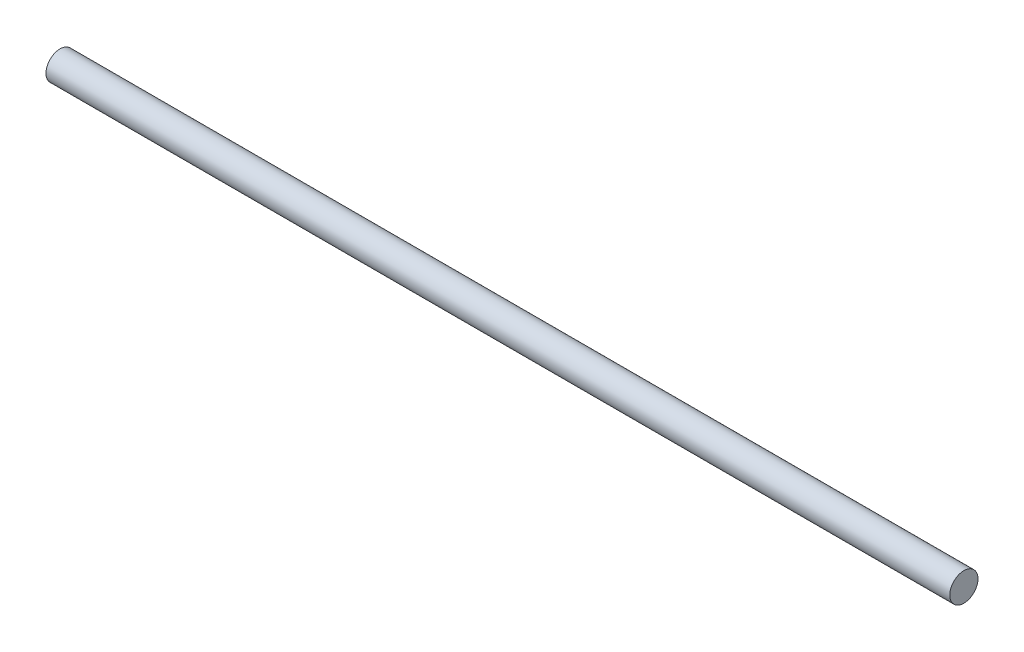
ISO-10303-21;
HEADER;
FILE_DESCRIPTION(('STEP AP214'),'2;1');
FILE_NAME('part.step','',(''),(''),'','','');
FILE_SCHEMA(('AUTOMOTIVE_DESIGN { 1 0 10303 214 1 1 1 1 }'));
ENDSEC;
DATA;
#1=APPLICATION_CONTEXT('core data for automotive mechanical design processes');
#2=APPLICATION_PROTOCOL_DEFINITION('international standard','automotive_design',2000,#1);
#3=PRODUCT_CONTEXT('',#1,'mechanical');
#4=PRODUCT('Part','Part','',(#3));
#5=PRODUCT_RELATED_PRODUCT_CATEGORY('part','',(#4));
#6=PRODUCT_DEFINITION_FORMATION('','',#4);
#7=PRODUCT_DEFINITION_CONTEXT('part definition',#1,'design');
#8=PRODUCT_DEFINITION('design','',#6,#7);
#9=PRODUCT_DEFINITION_SHAPE('','',#8);
#10=(LENGTH_UNIT() NAMED_UNIT(*) SI_UNIT(.MILLI.,.METRE.));
#11=(NAMED_UNIT(*) PLANE_ANGLE_UNIT() SI_UNIT($,.RADIAN.));
#12=(NAMED_UNIT(*) SI_UNIT($,.STERADIAN.) SOLID_ANGLE_UNIT());
#13=UNCERTAINTY_MEASURE_WITH_UNIT(LENGTH_MEASURE(1.E-05),#10,'distance_accuracy_value','');
#14=(GEOMETRIC_REPRESENTATION_CONTEXT(3) GLOBAL_UNCERTAINTY_ASSIGNED_CONTEXT((#13)) GLOBAL_UNIT_ASSIGNED_CONTEXT((#10,
#11,#12)) REPRESENTATION_CONTEXT('',''));
#15=CARTESIAN_POINT('',(0.,0.,0.));
#16=DIRECTION('',(0.,0.,1.));
#17=DIRECTION('',(1.,0.,0.));
#18=AXIS2_PLACEMENT_3D('',#15,#16,#17);
#19=CARTESIAN_POINT('',(406.4,0.,0.));
#20=DIRECTION('',(-1.,0.,0.));
#21=DIRECTION('',(0.,0.,1.));
#22=AXIS2_PLACEMENT_3D('',#19,#20,#21);
#23=CYLINDRICAL_SURFACE('',#22,6.35);
#24=CARTESIAN_POINT('',(406.4,0.,0.));
#25=DIRECTION('',(1.,0.,0.));
#26=DIRECTION('',(0.,0.,-1.));
#27=AXIS2_PLACEMENT_3D('',#24,#25,#26);
#28=CIRCLE('',#27,6.35);
#29=CARTESIAN_POINT('',(406.4,0.,-6.35));
#30=VERTEX_POINT('',#29);
#31=EDGE_CURVE('E10',#30,#30,#28,.T.);
#32=ORIENTED_EDGE('',*,*,#31,.F.);
#33=EDGE_LOOP('',(#32));
#34=FACE_BOUND('',#33,.T.);
#35=CARTESIAN_POINT('',(0.,0.,0.));
#36=DIRECTION('',(1.,0.,0.));
#37=DIRECTION('',(0.,0.,-1.));
#38=AXIS2_PLACEMENT_3D('',#35,#36,#37);
#39=CIRCLE('',#38,6.35);
#40=CARTESIAN_POINT('',(0.,0.,-6.35));
#41=VERTEX_POINT('',#40);
#42=EDGE_CURVE('E35',#41,#41,#39,.T.);
#43=ORIENTED_EDGE('',*,*,#42,.T.);
#44=EDGE_LOOP('',(#43));
#45=FACE_BOUND('',#44,.T.);
#46=ADVANCED_FACE('F32',(#34,#45),#23,.T.);
#47=CARTESIAN_POINT('',(406.4,0.,0.));
#48=DIRECTION('',(1.,0.,0.));
#49=DIRECTION('',(0.,0.,-1.));
#50=AXIS2_PLACEMENT_3D('',#47,#48,#49);
#51=PLANE('',#50);
#52=ORIENTED_EDGE('',*,*,#31,.T.);
#53=EDGE_LOOP('',(#52));
#54=FACE_BOUND('',#53,.T.);
#55=ADVANCED_FACE('F47',(#54),#51,.T.);
#56=CARTESIAN_POINT('',(0.,0.,0.));
#57=DIRECTION('',(1.,0.,0.));
#58=DIRECTION('',(0.,0.,-1.));
#59=AXIS2_PLACEMENT_3D('',#56,#57,#58);
#60=PLANE('',#59);
#61=ORIENTED_EDGE('',*,*,#42,.F.);
#62=EDGE_LOOP('',(#61));
#63=FACE_BOUND('',#62,.T.);
#64=ADVANCED_FACE('F45',(#63),#60,.F.);
#65=CLOSED_SHELL('',(#46,#55,#64));
#66=MANIFOLD_SOLID_BREP('B2',#65);
#67=ADVANCED_BREP_SHAPE_REPRESENTATION('',(#18,#66),#14);
#68=SHAPE_DEFINITION_REPRESENTATION(#9,#67);
ENDSEC;
END-ISO-10303-21;
